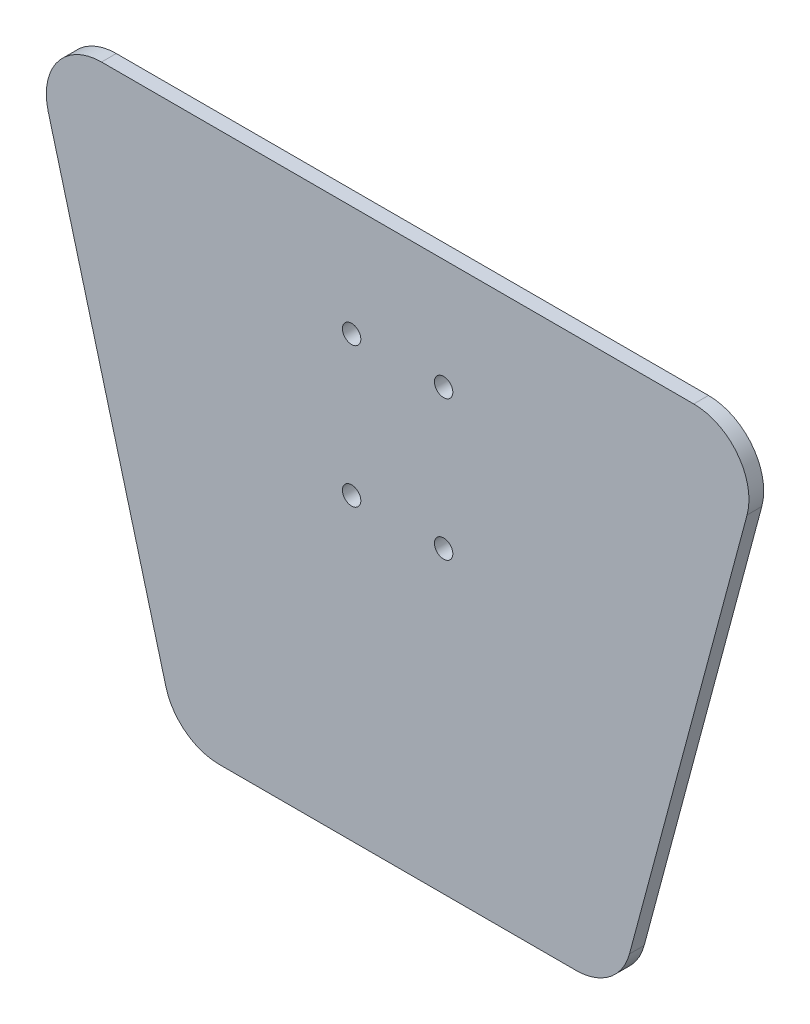
ISO-10303-21;
HEADER;
FILE_DESCRIPTION(('STEP AP214'),'2;1');
FILE_NAME('part.step','',(''),(''),'','','');
FILE_SCHEMA(('AUTOMOTIVE_DESIGN { 1 0 10303 214 1 1 1 1 }'));
ENDSEC;
DATA;
#1=APPLICATION_CONTEXT('core data for automotive mechanical design processes');
#2=APPLICATION_PROTOCOL_DEFINITION('international standard','automotive_design',2000,#1);
#3=PRODUCT_CONTEXT('',#1,'mechanical');
#4=PRODUCT('Part','Part','',(#3));
#5=PRODUCT_RELATED_PRODUCT_CATEGORY('part','',(#4));
#6=PRODUCT_DEFINITION_FORMATION('','',#4);
#7=PRODUCT_DEFINITION_CONTEXT('part definition',#1,'design');
#8=PRODUCT_DEFINITION('design','',#6,#7);
#9=PRODUCT_DEFINITION_SHAPE('','',#8);
#10=(LENGTH_UNIT() NAMED_UNIT(*) SI_UNIT(.MILLI.,.METRE.));
#11=(NAMED_UNIT(*) PLANE_ANGLE_UNIT() SI_UNIT($,.RADIAN.));
#12=(NAMED_UNIT(*) SI_UNIT($,.STERADIAN.) SOLID_ANGLE_UNIT());
#13=UNCERTAINTY_MEASURE_WITH_UNIT(LENGTH_MEASURE(1.E-05),#10,'distance_accuracy_value','');
#14=(GEOMETRIC_REPRESENTATION_CONTEXT(3) GLOBAL_UNCERTAINTY_ASSIGNED_CONTEXT((#13)) GLOBAL_UNIT_ASSIGNED_CONTEXT((#10,
#11,#12)) REPRESENTATION_CONTEXT('',''));
#15=CARTESIAN_POINT('',(0.,0.,0.));
#16=DIRECTION('',(0.,0.,1.));
#17=DIRECTION('',(1.,0.,0.));
#18=AXIS2_PLACEMENT_3D('',#15,#16,#17);
#19=CARTESIAN_POINT('',(-108.490095180316,15.,4.));
#20=DIRECTION('',(0.,0.,-1.));
#21=DIRECTION('',(-1.,0.,0.));
#22=AXIS2_PLACEMENT_3D('',#19,#20,#21);
#23=PLANE('',#22);
#24=CARTESIAN_POINT('',(-108.490095180316,15.,4.));
#25=DIRECTION('',(0.,0.,1.));
#26=DIRECTION('',(-1.,0.,0.));
#27=AXIS2_PLACEMENT_3D('',#24,#25,#26);
#28=CIRCLE('',#27,15.);
#29=CARTESIAN_POINT('',(-122.978982574652,11.1177143234622,4.));
#30=VERTEX_POINT('',#29);
#31=CARTESIAN_POINT('',(-108.490095180316,0.,4.));
#32=VERTEX_POINT('',#31);
#33=EDGE_CURVE('E147',#30,#32,#28,.T.);
#34=ORIENTED_EDGE('',*,*,#33,.T.);
#35=DIRECTION('',(1.,0.,0.));
#36=VECTOR('',#35,1.);
#37=CARTESIAN_POINT('',(-11.5099048196844,0.,4.));
#38=LINE('',#37,#36);
#39=CARTESIAN_POINT('',(-11.5099048196844,0.,4.));
#40=VERTEX_POINT('',#39);
#41=EDGE_CURVE('E95',#32,#40,#38,.T.);
#42=ORIENTED_EDGE('',*,*,#41,.T.);
#43=CARTESIAN_POINT('',(-11.5099048196844,15.,4.));
#44=DIRECTION('',(0.,0.,1.));
#45=DIRECTION('',(1.,0.,0.));
#46=AXIS2_PLACEMENT_3D('',#43,#44,#45);
#47=CIRCLE('',#46,15.);
#48=CARTESIAN_POINT('',(2.9789825746516,11.1177143234622,4.));
#49=VERTEX_POINT('',#48);
#50=EDGE_CURVE('E162',#40,#49,#47,.T.);
#51=ORIENTED_EDGE('',*,*,#50,.T.);
#52=DIRECTION('',(0.258819045102518,0.965925826289069,0.));
#53=VECTOR('',#52,1.);
#54=CARTESIAN_POINT('',(34.940506801718,130.399746626219,4.));
#55=LINE('',#54,#53);
#56=CARTESIAN_POINT('',(34.940506801718,130.399746626219,4.));
#57=VERTEX_POINT('',#56);
#58=EDGE_CURVE('E175',#49,#57,#55,.T.);
#59=ORIENTED_EDGE('',*,*,#58,.T.);
#60=CARTESIAN_POINT('',(20.451619407382,134.282032302757,4.));
#61=DIRECTION('',(0.,0.,1.));
#62=DIRECTION('',(-1.,0.,0.));
#63=AXIS2_PLACEMENT_3D('',#60,#61,#62);
#64=CIRCLE('',#63,15.);
#65=CARTESIAN_POINT('',(20.451619407382,149.282032302757,4.));
#66=VERTEX_POINT('',#65);
#67=EDGE_CURVE('E114',#57,#66,#64,.T.);
#68=ORIENTED_EDGE('',*,*,#67,.T.);
#69=DIRECTION('',(-1.,0.,0.));
#70=VECTOR('',#69,1.);
#71=CARTESIAN_POINT('',(-140.451619407382,149.282032302757,4.));
#72=LINE('',#71,#70);
#73=CARTESIAN_POINT('',(-140.451619407382,149.282032302757,4.));
#74=VERTEX_POINT('',#73);
#75=EDGE_CURVE('E108',#66,#74,#72,.T.);
#76=ORIENTED_EDGE('',*,*,#75,.T.);
#77=CARTESIAN_POINT('',(-140.451619407382,134.282032302757,4.));
#78=DIRECTION('',(0.,0.,1.));
#79=DIRECTION('',(-1.,0.,0.));
#80=AXIS2_PLACEMENT_3D('',#77,#78,#79);
#81=CIRCLE('',#80,15.);
#82=CARTESIAN_POINT('',(-154.940506801718,130.399746626219,4.));
#83=VERTEX_POINT('',#82);
#84=EDGE_CURVE('E112',#74,#83,#81,.T.);
#85=ORIENTED_EDGE('',*,*,#84,.T.);
#86=DIRECTION('',(0.258819045102518,-0.965925826289069,0.));
#87=VECTOR('',#86,1.);
#88=CARTESIAN_POINT('',(-122.978982574652,11.1177143234622,4.));
#89=LINE('',#88,#87);
#90=EDGE_CURVE('E52',#83,#30,#89,.T.);
#91=ORIENTED_EDGE('',*,*,#90,.T.);
#92=EDGE_LOOP('',(#34,#42,#51,#59,#68,#76,#85,#91));
#93=FACE_BOUND('',#92,.T.);
#94=CARTESIAN_POINT('',(-72.5,81.2820323027568,4.));
#95=DIRECTION('',(0.,0.,1.));
#96=DIRECTION('',(1.,0.,0.));
#97=AXIS2_PLACEMENT_3D('',#94,#95,#96);
#98=CIRCLE('',#97,2.50000000000001);
#99=CARTESIAN_POINT('',(-70.,81.2820323027568,4.));
#100=VERTEX_POINT('',#99);
#101=EDGE_CURVE('E136',#100,#100,#98,.T.);
#102=ORIENTED_EDGE('',*,*,#101,.F.);
#103=EDGE_LOOP('',(#102));
#104=FACE_BOUND('',#103,.T.);
#105=CARTESIAN_POINT('',(-72.4999999999999,119.282032302757,4.));
#106=DIRECTION('',(0.,0.,1.));
#107=DIRECTION('',(1.,0.,0.));
#108=AXIS2_PLACEMENT_3D('',#105,#106,#107);
#109=CIRCLE('',#108,2.50000000000001);
#110=CARTESIAN_POINT('',(-69.9999999999999,119.282032302757,4.));
#111=VERTEX_POINT('',#110);
#112=EDGE_CURVE('E184',#111,#111,#109,.T.);
#113=ORIENTED_EDGE('',*,*,#112,.F.);
#114=EDGE_LOOP('',(#113));
#115=FACE_BOUND('',#114,.T.);
#116=CARTESIAN_POINT('',(-47.5,81.2820323027568,4.));
#117=DIRECTION('',(0.,0.,1.));
#118=DIRECTION('',(-1.,0.,0.));
#119=AXIS2_PLACEMENT_3D('',#116,#117,#118);
#120=CIRCLE('',#119,2.50000000000001);
#121=CARTESIAN_POINT('',(-50.,81.2820323027568,4.));
#122=VERTEX_POINT('',#121);
#123=EDGE_CURVE('E190',#122,#122,#120,.T.);
#124=ORIENTED_EDGE('',*,*,#123,.F.);
#125=EDGE_LOOP('',(#124));
#126=FACE_BOUND('',#125,.T.);
#127=CARTESIAN_POINT('',(-47.5,119.282032302757,4.));
#128=DIRECTION('',(0.,0.,1.));
#129=DIRECTION('',(-1.,0.,0.));
#130=AXIS2_PLACEMENT_3D('',#127,#128,#129);
#131=CIRCLE('',#130,2.50000000000001);
#132=CARTESIAN_POINT('',(-50.,119.282032302757,4.));
#133=VERTEX_POINT('',#132);
#134=EDGE_CURVE('E196',#133,#133,#131,.T.);
#135=ORIENTED_EDGE('',*,*,#134,.F.);
#136=EDGE_LOOP('',(#135));
#137=FACE_BOUND('',#136,.T.);
#138=ADVANCED_FACE('F35',(#93,#104,#115,#126,#137),#23,.F.);
#139=CARTESIAN_POINT('',(-108.490095180316,15.,0.));
#140=DIRECTION('',(0.,0.,-1.));
#141=DIRECTION('',(-1.,0.,0.));
#142=AXIS2_PLACEMENT_3D('',#139,#140,#141);
#143=PLANE('',#142);
#144=CARTESIAN_POINT('',(-47.5,81.2820323027568,0.));
#145=DIRECTION('',(0.,0.,1.));
#146=DIRECTION('',(-1.,0.,0.));
#147=AXIS2_PLACEMENT_3D('',#144,#145,#146);
#148=CIRCLE('',#147,2.50000000000001);
#149=CARTESIAN_POINT('',(-50.,81.2820323027568,0.));
#150=VERTEX_POINT('',#149);
#151=EDGE_CURVE('E193',#150,#150,#148,.T.);
#152=ORIENTED_EDGE('',*,*,#151,.T.);
#153=EDGE_LOOP('',(#152));
#154=FACE_BOUND('',#153,.T.);
#155=CARTESIAN_POINT('',(-72.5,81.2820323027568,0.));
#156=DIRECTION('',(0.,0.,1.));
#157=DIRECTION('',(1.,0.,0.));
#158=AXIS2_PLACEMENT_3D('',#155,#156,#157);
#159=CIRCLE('',#158,2.50000000000001);
#160=CARTESIAN_POINT('',(-70.,81.2820323027568,0.));
#161=VERTEX_POINT('',#160);
#162=EDGE_CURVE('E181',#161,#161,#159,.T.);
#163=ORIENTED_EDGE('',*,*,#162,.T.);
#164=EDGE_LOOP('',(#163));
#165=FACE_BOUND('',#164,.T.);
#166=CARTESIAN_POINT('',(-108.490095180316,15.,0.));
#167=DIRECTION('',(0.,0.,1.));
#168=DIRECTION('',(-1.,0.,0.));
#169=AXIS2_PLACEMENT_3D('',#166,#167,#168);
#170=CIRCLE('',#169,15.);
#171=CARTESIAN_POINT('',(-122.978982574652,11.1177143234622,0.));
#172=VERTEX_POINT('',#171);
#173=CARTESIAN_POINT('',(-108.490095180316,0.,0.));
#174=VERTEX_POINT('',#173);
#175=EDGE_CURVE('E132',#172,#174,#170,.T.);
#176=ORIENTED_EDGE('',*,*,#175,.F.);
#177=DIRECTION('',(0.258819045102518,-0.965925826289069,0.));
#178=VECTOR('',#177,1.);
#179=CARTESIAN_POINT('',(-122.978982574652,11.1177143234622,0.));
#180=LINE('',#179,#178);
#181=CARTESIAN_POINT('',(-154.940506801718,130.399746626219,0.));
#182=VERTEX_POINT('',#181);
#183=EDGE_CURVE('E87',#182,#172,#180,.T.);
#184=ORIENTED_EDGE('',*,*,#183,.F.);
#185=CARTESIAN_POINT('',(-140.451619407382,134.282032302757,0.));
#186=DIRECTION('',(0.,0.,1.));
#187=DIRECTION('',(-1.,0.,0.));
#188=AXIS2_PLACEMENT_3D('',#185,#186,#187);
#189=CIRCLE('',#188,15.);
#190=CARTESIAN_POINT('',(-140.451619407382,149.282032302757,0.));
#191=VERTEX_POINT('',#190);
#192=EDGE_CURVE('E81',#191,#182,#189,.T.);
#193=ORIENTED_EDGE('',*,*,#192,.F.);
#194=DIRECTION('',(-1.,0.,0.));
#195=VECTOR('',#194,1.);
#196=CARTESIAN_POINT('',(-140.451619407382,149.282032302757,0.));
#197=LINE('',#196,#195);
#198=CARTESIAN_POINT('',(20.451619407382,149.282032302757,0.));
#199=VERTEX_POINT('',#198);
#200=EDGE_CURVE('E122',#199,#191,#197,.T.);
#201=ORIENTED_EDGE('',*,*,#200,.F.);
#202=CARTESIAN_POINT('',(20.451619407382,134.282032302757,0.));
#203=DIRECTION('',(0.,0.,1.));
#204=DIRECTION('',(-1.,0.,0.));
#205=AXIS2_PLACEMENT_3D('',#202,#203,#204);
#206=CIRCLE('',#205,15.);
#207=CARTESIAN_POINT('',(34.940506801718,130.399746626219,0.));
#208=VERTEX_POINT('',#207);
#209=EDGE_CURVE('E142',#208,#199,#206,.T.);
#210=ORIENTED_EDGE('',*,*,#209,.F.);
#211=DIRECTION('',(0.258819045102518,0.965925826289069,0.));
#212=VECTOR('',#211,1.);
#213=CARTESIAN_POINT('',(34.940506801718,130.399746626219,0.));
#214=LINE('',#213,#212);
#215=CARTESIAN_POINT('',(2.9789825746516,11.1177143234622,0.));
#216=VERTEX_POINT('',#215);
#217=EDGE_CURVE('E140',#216,#208,#214,.T.);
#218=ORIENTED_EDGE('',*,*,#217,.F.);
#219=CARTESIAN_POINT('',(-11.5099048196844,15.,0.));
#220=DIRECTION('',(0.,0.,1.));
#221=DIRECTION('',(1.,0.,0.));
#222=AXIS2_PLACEMENT_3D('',#219,#220,#221);
#223=CIRCLE('',#222,15.);
#224=CARTESIAN_POINT('',(-11.5099048196844,0.,0.));
#225=VERTEX_POINT('',#224);
#226=EDGE_CURVE('E138',#225,#216,#223,.T.);
#227=ORIENTED_EDGE('',*,*,#226,.F.);
#228=DIRECTION('',(1.,0.,0.));
#229=VECTOR('',#228,1.);
#230=CARTESIAN_POINT('',(-11.5099048196844,0.,0.));
#231=LINE('',#230,#229);
#232=EDGE_CURVE('E135',#174,#225,#231,.T.);
#233=ORIENTED_EDGE('',*,*,#232,.F.);
#234=EDGE_LOOP('',(#176,#184,#193,#201,#210,#218,#227,#233));
#235=FACE_BOUND('',#234,.T.);
#236=CARTESIAN_POINT('',(-72.4999999999999,119.282032302757,0.));
#237=DIRECTION('',(0.,0.,1.));
#238=DIRECTION('',(1.,0.,0.));
#239=AXIS2_PLACEMENT_3D('',#236,#237,#238);
#240=CIRCLE('',#239,2.50000000000001);
#241=CARTESIAN_POINT('',(-69.9999999999999,119.282032302757,0.));
#242=VERTEX_POINT('',#241);
#243=EDGE_CURVE('E187',#242,#242,#240,.T.);
#244=ORIENTED_EDGE('',*,*,#243,.T.);
#245=EDGE_LOOP('',(#244));
#246=FACE_BOUND('',#245,.T.);
#247=CARTESIAN_POINT('',(-47.5,119.282032302757,0.));
#248=DIRECTION('',(0.,0.,1.));
#249=DIRECTION('',(-1.,0.,0.));
#250=AXIS2_PLACEMENT_3D('',#247,#248,#249);
#251=CIRCLE('',#250,2.50000000000001);
#252=CARTESIAN_POINT('',(-50.,119.282032302757,0.));
#253=VERTEX_POINT('',#252);
#254=EDGE_CURVE('E199',#253,#253,#251,.T.);
#255=ORIENTED_EDGE('',*,*,#254,.T.);
#256=EDGE_LOOP('',(#255));
#257=FACE_BOUND('',#256,.T.);
#258=ADVANCED_FACE('F166',(#154,#165,#235,#246,#257),#143,.T.);
#259=CARTESIAN_POINT('',(-108.490095180316,15.,4.));
#260=DIRECTION('',(0.,0.,-1.));
#261=DIRECTION('',(-1.,0.,0.));
#262=AXIS2_PLACEMENT_3D('',#259,#260,#261);
#263=CYLINDRICAL_SURFACE('',#262,15.);
#264=ORIENTED_EDGE('',*,*,#175,.T.);
#265=DIRECTION('',(0.,0.,-1.));
#266=VECTOR('',#265,1.);
#267=CARTESIAN_POINT('',(-108.490095180316,0.,4.));
#268=LINE('',#267,#266);
#269=EDGE_CURVE('E11',#32,#174,#268,.T.);
#270=ORIENTED_EDGE('',*,*,#269,.F.);
#271=ORIENTED_EDGE('',*,*,#33,.F.);
#272=DIRECTION('',(0.,0.,-1.));
#273=VECTOR('',#272,1.);
#274=CARTESIAN_POINT('',(-122.978982574652,11.1177143234622,4.));
#275=LINE('',#274,#273);
#276=EDGE_CURVE('E128',#30,#172,#275,.T.);
#277=ORIENTED_EDGE('',*,*,#276,.T.);
#278=EDGE_LOOP('',(#264,#270,#271,#277));
#279=FACE_BOUND('',#278,.T.);
#280=ADVANCED_FACE('F37',(#279),#263,.T.);
#281=CARTESIAN_POINT('',(-11.5099048196844,0.,4.));
#282=DIRECTION('',(0.,1.,0.));
#283=DIRECTION('',(0.,0.,1.));
#284=AXIS2_PLACEMENT_3D('',#281,#282,#283);
#285=PLANE('',#284);
#286=ORIENTED_EDGE('',*,*,#232,.T.);
#287=DIRECTION('',(0.,0.,-1.));
#288=VECTOR('',#287,1.);
#289=CARTESIAN_POINT('',(-11.5099048196844,0.,4.));
#290=LINE('',#289,#288);
#291=EDGE_CURVE('E44',#40,#225,#290,.T.);
#292=ORIENTED_EDGE('',*,*,#291,.F.);
#293=ORIENTED_EDGE('',*,*,#41,.F.);
#294=ORIENTED_EDGE('',*,*,#269,.T.);
#295=EDGE_LOOP('',(#286,#292,#293,#294));
#296=FACE_BOUND('',#295,.T.);
#297=ADVANCED_FACE('F231',(#296),#285,.F.);
#298=CARTESIAN_POINT('',(-11.5099048196844,15.,4.));
#299=DIRECTION('',(0.,0.,-1.));
#300=DIRECTION('',(-1.,0.,0.));
#301=AXIS2_PLACEMENT_3D('',#298,#299,#300);
#302=CYLINDRICAL_SURFACE('',#301,15.);
#303=ORIENTED_EDGE('',*,*,#226,.T.);
#304=DIRECTION('',(0.,0.,-1.));
#305=VECTOR('',#304,1.);
#306=CARTESIAN_POINT('',(2.9789825746516,11.1177143234622,4.));
#307=LINE('',#306,#305);
#308=EDGE_CURVE('E154',#49,#216,#307,.T.);
#309=ORIENTED_EDGE('',*,*,#308,.F.);
#310=ORIENTED_EDGE('',*,*,#50,.F.);
#311=ORIENTED_EDGE('',*,*,#291,.T.);
#312=EDGE_LOOP('',(#303,#309,#310,#311));
#313=FACE_BOUND('',#312,.T.);
#314=ADVANCED_FACE('F160',(#313),#302,.T.);
#315=CARTESIAN_POINT('',(34.940506801718,130.399746626219,4.));
#316=DIRECTION('',(-0.965925826289069,0.258819045102518,0.));
#317=DIRECTION('',(-0.258819045102518,-0.965925826289069,0.));
#318=AXIS2_PLACEMENT_3D('',#315,#316,#317);
#319=PLANE('',#318);
#320=ORIENTED_EDGE('',*,*,#217,.T.);
#321=DIRECTION('',(0.,0.,-1.));
#322=VECTOR('',#321,1.);
#323=CARTESIAN_POINT('',(34.940506801718,130.399746626219,4.));
#324=LINE('',#323,#322);
#325=EDGE_CURVE('E151',#57,#208,#324,.T.);
#326=ORIENTED_EDGE('',*,*,#325,.F.);
#327=ORIENTED_EDGE('',*,*,#58,.F.);
#328=ORIENTED_EDGE('',*,*,#308,.T.);
#329=EDGE_LOOP('',(#320,#326,#327,#328));
#330=FACE_BOUND('',#329,.T.);
#331=ADVANCED_FACE('F171',(#330),#319,.F.);
#332=CARTESIAN_POINT('',(20.451619407382,134.282032302757,4.));
#333=DIRECTION('',(0.,0.,-1.));
#334=DIRECTION('',(-1.,0.,0.));
#335=AXIS2_PLACEMENT_3D('',#332,#333,#334);
#336=CYLINDRICAL_SURFACE('',#335,15.);
#337=ORIENTED_EDGE('',*,*,#209,.T.);
#338=DIRECTION('',(0.,0.,-1.));
#339=VECTOR('',#338,1.);
#340=CARTESIAN_POINT('',(20.451619407382,149.282032302757,4.));
#341=LINE('',#340,#339);
#342=EDGE_CURVE('E123',#66,#199,#341,.T.);
#343=ORIENTED_EDGE('',*,*,#342,.F.);
#344=ORIENTED_EDGE('',*,*,#67,.F.);
#345=ORIENTED_EDGE('',*,*,#325,.T.);
#346=EDGE_LOOP('',(#337,#343,#344,#345));
#347=FACE_BOUND('',#346,.T.);
#348=ADVANCED_FACE('F174',(#347),#336,.T.);
#349=CARTESIAN_POINT('',(-140.451619407382,149.282032302757,4.));
#350=DIRECTION('',(0.,-1.,0.));
#351=DIRECTION('',(1.,0.,0.));
#352=AXIS2_PLACEMENT_3D('',#349,#350,#351);
#353=PLANE('',#352);
#354=ORIENTED_EDGE('',*,*,#200,.T.);
#355=DIRECTION('',(0.,0.,-1.));
#356=VECTOR('',#355,1.);
#357=CARTESIAN_POINT('',(-140.451619407382,149.282032302757,4.));
#358=LINE('',#357,#356);
#359=EDGE_CURVE('E119',#74,#191,#358,.T.);
#360=ORIENTED_EDGE('',*,*,#359,.F.);
#361=ORIENTED_EDGE('',*,*,#75,.F.);
#362=ORIENTED_EDGE('',*,*,#342,.T.);
#363=EDGE_LOOP('',(#354,#360,#361,#362));
#364=FACE_BOUND('',#363,.T.);
#365=ADVANCED_FACE('F120',(#364),#353,.F.);
#366=CARTESIAN_POINT('',(-140.451619407382,134.282032302757,4.));
#367=DIRECTION('',(0.,0.,-1.));
#368=DIRECTION('',(-1.,0.,0.));
#369=AXIS2_PLACEMENT_3D('',#366,#367,#368);
#370=CYLINDRICAL_SURFACE('',#369,15.);
#371=ORIENTED_EDGE('',*,*,#192,.T.);
#372=DIRECTION('',(0.,0.,-1.));
#373=VECTOR('',#372,1.);
#374=CARTESIAN_POINT('',(-154.940506801718,130.399746626219,4.));
#375=LINE('',#374,#373);
#376=EDGE_CURVE('E124',#83,#182,#375,.T.);
#377=ORIENTED_EDGE('',*,*,#376,.F.);
#378=ORIENTED_EDGE('',*,*,#84,.F.);
#379=ORIENTED_EDGE('',*,*,#359,.T.);
#380=EDGE_LOOP('',(#371,#377,#378,#379));
#381=FACE_BOUND('',#380,.T.);
#382=ADVANCED_FACE('F126',(#381),#370,.T.);
#383=CARTESIAN_POINT('',(-122.978982574652,11.1177143234622,4.));
#384=DIRECTION('',(0.965925826289069,0.258819045102518,0.));
#385=DIRECTION('',(-0.258819045102518,0.965925826289069,0.));
#386=AXIS2_PLACEMENT_3D('',#383,#384,#385);
#387=PLANE('',#386);
#388=ORIENTED_EDGE('',*,*,#183,.T.);
#389=ORIENTED_EDGE('',*,*,#276,.F.);
#390=ORIENTED_EDGE('',*,*,#90,.F.);
#391=ORIENTED_EDGE('',*,*,#376,.T.);
#392=EDGE_LOOP('',(#388,#389,#390,#391));
#393=FACE_BOUND('',#392,.T.);
#394=ADVANCED_FACE('F219',(#393),#387,.F.);
#395=CARTESIAN_POINT('',(-72.5,81.2820323027568,4.));
#396=DIRECTION('',(0.,0.,-1.));
#397=DIRECTION('',(-1.,0.,0.));
#398=AXIS2_PLACEMENT_3D('',#395,#396,#397);
#399=CYLINDRICAL_SURFACE('',#398,2.50000000000001);
#400=ORIENTED_EDGE('',*,*,#101,.T.);
#401=EDGE_LOOP('',(#400));
#402=FACE_BOUND('',#401,.T.);
#403=ORIENTED_EDGE('',*,*,#162,.F.);
#404=EDGE_LOOP('',(#403));
#405=FACE_BOUND('',#404,.T.);
#406=ADVANCED_FACE('F216',(#402,#405),#399,.F.);
#407=CARTESIAN_POINT('',(-72.4999999999999,119.282032302757,4.));
#408=DIRECTION('',(0.,0.,-1.));
#409=DIRECTION('',(-1.,0.,0.));
#410=AXIS2_PLACEMENT_3D('',#407,#408,#409);
#411=CYLINDRICAL_SURFACE('',#410,2.50000000000001);
#412=ORIENTED_EDGE('',*,*,#112,.T.);
#413=EDGE_LOOP('',(#412));
#414=FACE_BOUND('',#413,.T.);
#415=ORIENTED_EDGE('',*,*,#243,.F.);
#416=EDGE_LOOP('',(#415));
#417=FACE_BOUND('',#416,.T.);
#418=ADVANCED_FACE('F295',(#414,#417),#411,.F.);
#419=CARTESIAN_POINT('',(-47.5,81.2820323027568,4.));
#420=DIRECTION('',(0.,0.,-1.));
#421=DIRECTION('',(-1.,0.,0.));
#422=AXIS2_PLACEMENT_3D('',#419,#420,#421);
#423=CYLINDRICAL_SURFACE('',#422,2.50000000000001);
#424=ORIENTED_EDGE('',*,*,#123,.T.);
#425=EDGE_LOOP('',(#424));
#426=FACE_BOUND('',#425,.T.);
#427=ORIENTED_EDGE('',*,*,#151,.F.);
#428=EDGE_LOOP('',(#427));
#429=FACE_BOUND('',#428,.T.);
#430=ADVANCED_FACE('F303',(#426,#429),#423,.F.);
#431=CARTESIAN_POINT('',(-47.5,119.282032302757,4.));
#432=DIRECTION('',(0.,0.,-1.));
#433=DIRECTION('',(-1.,0.,0.));
#434=AXIS2_PLACEMENT_3D('',#431,#432,#433);
#435=CYLINDRICAL_SURFACE('',#434,2.50000000000001);
#436=ORIENTED_EDGE('',*,*,#134,.T.);
#437=EDGE_LOOP('',(#436));
#438=FACE_BOUND('',#437,.T.);
#439=ORIENTED_EDGE('',*,*,#254,.F.);
#440=EDGE_LOOP('',(#439));
#441=FACE_BOUND('',#440,.T.);
#442=ADVANCED_FACE('F205',(#438,#441),#435,.F.);
#443=CLOSED_SHELL('',(#138,#258,#280,#297,#314,#331,#348,#365,#382,#394,#406,#418,#430,#442));
#444=MANIFOLD_SOLID_BREP('B2',#443);
#445=ADVANCED_BREP_SHAPE_REPRESENTATION('',(#18,#444),#14);
#446=SHAPE_DEFINITION_REPRESENTATION(#9,#445);
ENDSEC;
END-ISO-10303-21;
